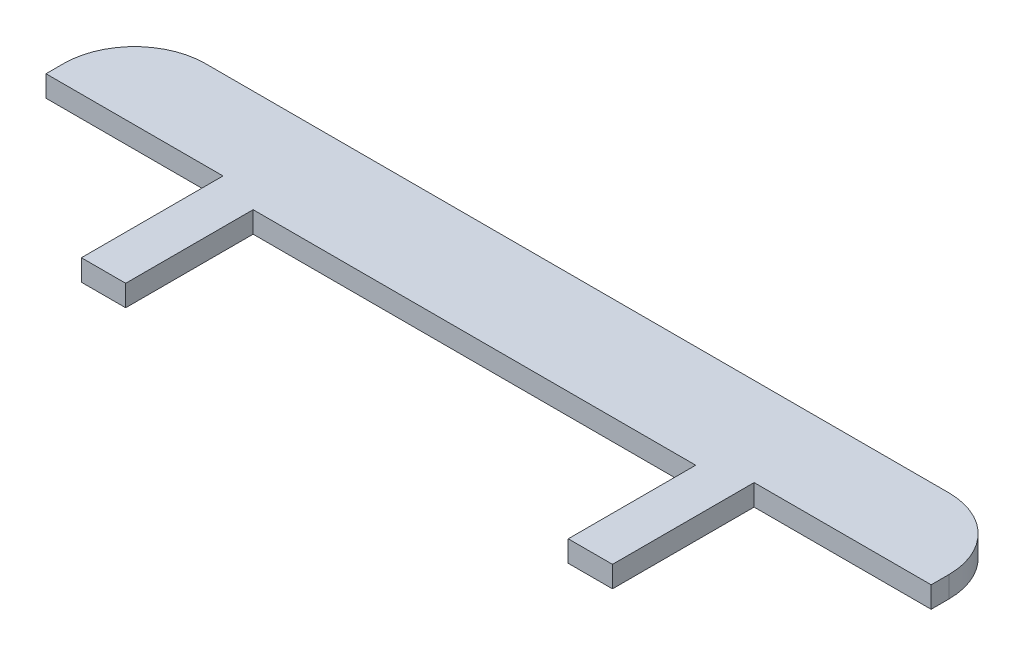
ISO-10303-21;
HEADER;
FILE_DESCRIPTION(('STEP AP214'),'2;1');
FILE_NAME('part.step','',(''),(''),'','','');
FILE_SCHEMA(('AUTOMOTIVE_DESIGN { 1 0 10303 214 1 1 1 1 }'));
ENDSEC;
DATA;
#1=APPLICATION_CONTEXT('core data for automotive mechanical design processes');
#2=APPLICATION_PROTOCOL_DEFINITION('international standard','automotive_design',2000,#1);
#3=PRODUCT_CONTEXT('',#1,'mechanical');
#4=PRODUCT('Part','Part','',(#3));
#5=PRODUCT_RELATED_PRODUCT_CATEGORY('part','',(#4));
#6=PRODUCT_DEFINITION_FORMATION('','',#4);
#7=PRODUCT_DEFINITION_CONTEXT('part definition',#1,'design');
#8=PRODUCT_DEFINITION('design','',#6,#7);
#9=PRODUCT_DEFINITION_SHAPE('','',#8);
#10=(LENGTH_UNIT() NAMED_UNIT(*) SI_UNIT(.MILLI.,.METRE.));
#11=(NAMED_UNIT(*) PLANE_ANGLE_UNIT() SI_UNIT($,.RADIAN.));
#12=(NAMED_UNIT(*) SI_UNIT($,.STERADIAN.) SOLID_ANGLE_UNIT());
#13=UNCERTAINTY_MEASURE_WITH_UNIT(LENGTH_MEASURE(1.E-05),#10,'distance_accuracy_value','');
#14=(GEOMETRIC_REPRESENTATION_CONTEXT(3) GLOBAL_UNCERTAINTY_ASSIGNED_CONTEXT((#13)) GLOBAL_UNIT_ASSIGNED_CONTEXT((#10,
#11,#12)) REPRESENTATION_CONTEXT('',''));
#15=CARTESIAN_POINT('',(0.,0.,0.));
#16=DIRECTION('',(0.,0.,1.));
#17=DIRECTION('',(1.,0.,0.));
#18=AXIS2_PLACEMENT_3D('',#15,#16,#17);
#19=CARTESIAN_POINT('',(-31.75,1.524,0.));
#20=DIRECTION('',(1.,0.,0.));
#21=DIRECTION('',(0.,0.,-1.));
#22=AXIS2_PLACEMENT_3D('',#19,#20,#21);
#23=PLANE('',#22);
#24=DIRECTION('',(0.,0.,1.));
#25=VECTOR('',#24,1.);
#26=CARTESIAN_POINT('',(-31.75,1.524,0.));
#27=LINE('',#26,#25);
#28=CARTESIAN_POINT('',(-31.75,1.524,-1.27));
#29=VERTEX_POINT('',#28);
#30=CARTESIAN_POINT('',(-31.75,1.524,0.));
#31=VERTEX_POINT('',#30);
#32=EDGE_CURVE('E143',#29,#31,#27,.T.);
#33=ORIENTED_EDGE('',*,*,#32,.F.);
#34=DIRECTION('',(0.,-1.,0.));
#35=VECTOR('',#34,1.);
#36=CARTESIAN_POINT('',(-31.75,1.524,-1.27));
#37=LINE('',#36,#35);
#38=CARTESIAN_POINT('',(-31.75,0.,-1.27));
#39=VERTEX_POINT('',#38);
#40=EDGE_CURVE('E11',#29,#39,#37,.T.);
#41=ORIENTED_EDGE('',*,*,#40,.T.);
#42=DIRECTION('',(0.,0.,1.));
#43=VECTOR('',#42,1.);
#44=CARTESIAN_POINT('',(-31.75,0.,0.));
#45=LINE('',#44,#43);
#46=CARTESIAN_POINT('',(-31.75,0.,0.));
#47=VERTEX_POINT('',#46);
#48=EDGE_CURVE('E165',#39,#47,#45,.T.);
#49=ORIENTED_EDGE('',*,*,#48,.T.);
#50=DIRECTION('',(0.,-1.,0.));
#51=VECTOR('',#50,1.);
#52=CARTESIAN_POINT('',(-31.75,1.524,0.));
#53=LINE('',#52,#51);
#54=EDGE_CURVE('E157',#31,#47,#53,.T.);
#55=ORIENTED_EDGE('',*,*,#54,.F.);
#56=EDGE_LOOP('',(#33,#41,#49,#55));
#57=FACE_BOUND('',#56,.T.);
#58=ADVANCED_FACE('F41',(#57),#23,.F.);
#59=CARTESIAN_POINT('',(-31.75,1.524,0.));
#60=DIRECTION('',(0.,0.,-1.));
#61=DIRECTION('',(-1.,0.,0.));
#62=AXIS2_PLACEMENT_3D('',#59,#60,#61);
#63=PLANE('',#62);
#64=DIRECTION('',(1.,0.,0.));
#65=VECTOR('',#64,1.);
#66=CARTESIAN_POINT('',(-31.75,0.,0.));
#67=LINE('',#66,#65);
#68=CARTESIAN_POINT('',(-19.05,0.,0.));
#69=VERTEX_POINT('',#68);
#70=EDGE_CURVE('E271',#47,#69,#67,.T.);
#71=ORIENTED_EDGE('',*,*,#70,.T.);
#72=DIRECTION('',(0.,-1.,0.));
#73=VECTOR('',#72,1.);
#74=CARTESIAN_POINT('',(-19.05,1.524,0.));
#75=LINE('',#74,#73);
#76=CARTESIAN_POINT('',(-19.05,1.524,0.));
#77=VERTEX_POINT('',#76);
#78=EDGE_CURVE('E159',#77,#69,#75,.T.);
#79=ORIENTED_EDGE('',*,*,#78,.F.);
#80=DIRECTION('',(1.,0.,0.));
#81=VECTOR('',#80,1.);
#82=CARTESIAN_POINT('',(-31.75,1.524,0.));
#83=LINE('',#82,#81);
#84=EDGE_CURVE('E146',#31,#77,#83,.T.);
#85=ORIENTED_EDGE('',*,*,#84,.F.);
#86=ORIENTED_EDGE('',*,*,#54,.T.);
#87=EDGE_LOOP('',(#71,#79,#85,#86));
#88=FACE_BOUND('',#87,.T.);
#89=ADVANCED_FACE('F156',(#88),#63,.F.);
#90=CARTESIAN_POINT('',(-19.05,1.524,0.));
#91=DIRECTION('',(1.,0.,0.));
#92=DIRECTION('',(0.,0.,-1.));
#93=AXIS2_PLACEMENT_3D('',#90,#91,#92);
#94=PLANE('',#93);
#95=DIRECTION('',(0.,0.,1.));
#96=VECTOR('',#95,1.);
#97=CARTESIAN_POINT('',(-19.05,0.,0.));
#98=LINE('',#97,#96);
#99=CARTESIAN_POINT('',(-19.05,0.,10.16));
#100=VERTEX_POINT('',#99);
#101=EDGE_CURVE('E262',#69,#100,#98,.T.);
#102=ORIENTED_EDGE('',*,*,#101,.T.);
#103=DIRECTION('',(0.,-1.,0.));
#104=VECTOR('',#103,1.);
#105=CARTESIAN_POINT('',(-19.05,1.524,10.16));
#106=LINE('',#105,#104);
#107=CARTESIAN_POINT('',(-19.05,1.524,10.16));
#108=VERTEX_POINT('',#107);
#109=EDGE_CURVE('E174',#108,#100,#106,.T.);
#110=ORIENTED_EDGE('',*,*,#109,.F.);
#111=DIRECTION('',(0.,0.,1.));
#112=VECTOR('',#111,1.);
#113=CARTESIAN_POINT('',(-19.05,1.524,0.));
#114=LINE('',#113,#112);
#115=EDGE_CURVE('E162',#77,#108,#114,.T.);
#116=ORIENTED_EDGE('',*,*,#115,.F.);
#117=ORIENTED_EDGE('',*,*,#78,.T.);
#118=EDGE_LOOP('',(#102,#110,#116,#117));
#119=FACE_BOUND('',#118,.T.);
#120=ADVANCED_FACE('F306',(#119),#94,.F.);
#121=CARTESIAN_POINT('',(-19.05,1.524,10.16));
#122=DIRECTION('',(0.,0.,-1.));
#123=DIRECTION('',(-1.,0.,0.));
#124=AXIS2_PLACEMENT_3D('',#121,#122,#123);
#125=PLANE('',#124);
#126=DIRECTION('',(1.,0.,0.));
#127=VECTOR('',#126,1.);
#128=CARTESIAN_POINT('',(-19.05,0.,10.16));
#129=LINE('',#128,#127);
#130=CARTESIAN_POINT('',(-15.875,0.,10.16));
#131=VERTEX_POINT('',#130);
#132=EDGE_CURVE('E257',#100,#131,#129,.T.);
#133=ORIENTED_EDGE('',*,*,#132,.T.);
#134=DIRECTION('',(0.,-1.,0.));
#135=VECTOR('',#134,1.);
#136=CARTESIAN_POINT('',(-15.875,1.524,10.16));
#137=LINE('',#136,#135);
#138=CARTESIAN_POINT('',(-15.875,1.524,10.16));
#139=VERTEX_POINT('',#138);
#140=EDGE_CURVE('E246',#139,#131,#137,.T.);
#141=ORIENTED_EDGE('',*,*,#140,.F.);
#142=DIRECTION('',(1.,0.,0.));
#143=VECTOR('',#142,1.);
#144=CARTESIAN_POINT('',(-19.05,1.524,10.16));
#145=LINE('',#144,#143);
#146=EDGE_CURVE('E258',#108,#139,#145,.T.);
#147=ORIENTED_EDGE('',*,*,#146,.F.);
#148=ORIENTED_EDGE('',*,*,#109,.T.);
#149=EDGE_LOOP('',(#133,#141,#147,#148));
#150=FACE_BOUND('',#149,.T.);
#151=ADVANCED_FACE('F255',(#150),#125,.F.);
#152=CARTESIAN_POINT('',(-15.875,1.524,10.16));
#153=DIRECTION('',(-1.,0.,0.));
#154=DIRECTION('',(0.,0.,1.));
#155=AXIS2_PLACEMENT_3D('',#152,#153,#154);
#156=PLANE('',#155);
#157=DIRECTION('',(0.,0.,-1.));
#158=VECTOR('',#157,1.);
#159=CARTESIAN_POINT('',(-15.875,0.,10.16));
#160=LINE('',#159,#158);
#161=CARTESIAN_POINT('',(-15.875,0.,1.016));
#162=VERTEX_POINT('',#161);
#163=EDGE_CURVE('E264',#131,#162,#160,.T.);
#164=ORIENTED_EDGE('',*,*,#163,.T.);
#165=DIRECTION('',(0.,-1.,0.));
#166=VECTOR('',#165,1.);
#167=CARTESIAN_POINT('',(-15.875,1.524,1.016));
#168=LINE('',#167,#166);
#169=CARTESIAN_POINT('',(-15.875,1.524,1.016));
#170=VERTEX_POINT('',#169);
#171=EDGE_CURVE('E242',#170,#162,#168,.T.);
#172=ORIENTED_EDGE('',*,*,#171,.F.);
#173=DIRECTION('',(0.,0.,-1.));
#174=VECTOR('',#173,1.);
#175=CARTESIAN_POINT('',(-15.875,1.524,10.16));
#176=LINE('',#175,#174);
#177=EDGE_CURVE('E310',#139,#170,#176,.T.);
#178=ORIENTED_EDGE('',*,*,#177,.F.);
#179=ORIENTED_EDGE('',*,*,#140,.T.);
#180=EDGE_LOOP('',(#164,#172,#178,#179));
#181=FACE_BOUND('',#180,.T.);
#182=ADVANCED_FACE('F336',(#181),#156,.F.);
#183=CARTESIAN_POINT('',(-15.875,1.524,1.016));
#184=DIRECTION('',(0.,0.,-1.));
#185=DIRECTION('',(-1.,0.,0.));
#186=AXIS2_PLACEMENT_3D('',#183,#184,#185);
#187=PLANE('',#186);
#188=DIRECTION('',(1.,0.,0.));
#189=VECTOR('',#188,1.);
#190=CARTESIAN_POINT('',(-15.875,0.,1.016));
#191=LINE('',#190,#189);
#192=CARTESIAN_POINT('',(15.875,0.,1.016));
#193=VERTEX_POINT('',#192);
#194=EDGE_CURVE('E269',#162,#193,#191,.T.);
#195=ORIENTED_EDGE('',*,*,#194,.T.);
#196=DIRECTION('',(0.,-1.,0.));
#197=VECTOR('',#196,1.);
#198=CARTESIAN_POINT('',(15.875,1.524,1.016));
#199=LINE('',#198,#197);
#200=CARTESIAN_POINT('',(15.875,1.524,1.016));
#201=VERTEX_POINT('',#200);
#202=EDGE_CURVE('E238',#201,#193,#199,.T.);
#203=ORIENTED_EDGE('',*,*,#202,.F.);
#204=DIRECTION('',(1.,0.,0.));
#205=VECTOR('',#204,1.);
#206=CARTESIAN_POINT('',(-15.875,1.524,1.016));
#207=LINE('',#206,#205);
#208=EDGE_CURVE('E315',#170,#201,#207,.T.);
#209=ORIENTED_EDGE('',*,*,#208,.F.);
#210=ORIENTED_EDGE('',*,*,#171,.T.);
#211=EDGE_LOOP('',(#195,#203,#209,#210));
#212=FACE_BOUND('',#211,.T.);
#213=ADVANCED_FACE('F332',(#212),#187,.F.);
#214=CARTESIAN_POINT('',(15.875,1.524,10.16));
#215=DIRECTION('',(1.,0.,0.));
#216=DIRECTION('',(0.,0.,-1.));
#217=AXIS2_PLACEMENT_3D('',#214,#215,#216);
#218=PLANE('',#217);
#219=DIRECTION('',(0.,0.,1.));
#220=VECTOR('',#219,1.);
#221=CARTESIAN_POINT('',(15.875,0.,10.16));
#222=LINE('',#221,#220);
#223=CARTESIAN_POINT('',(15.875,0.,10.16));
#224=VERTEX_POINT('',#223);
#225=EDGE_CURVE('E277',#193,#224,#222,.T.);
#226=ORIENTED_EDGE('',*,*,#225,.T.);
#227=DIRECTION('',(0.,-1.,0.));
#228=VECTOR('',#227,1.);
#229=CARTESIAN_POINT('',(15.875,1.524,10.16));
#230=LINE('',#229,#228);
#231=CARTESIAN_POINT('',(15.875,1.524,10.16));
#232=VERTEX_POINT('',#231);
#233=EDGE_CURVE('E234',#232,#224,#230,.T.);
#234=ORIENTED_EDGE('',*,*,#233,.F.);
#235=DIRECTION('',(0.,0.,1.));
#236=VECTOR('',#235,1.);
#237=CARTESIAN_POINT('',(15.875,1.524,10.16));
#238=LINE('',#237,#236);
#239=EDGE_CURVE('E318',#201,#232,#238,.T.);
#240=ORIENTED_EDGE('',*,*,#239,.F.);
#241=ORIENTED_EDGE('',*,*,#202,.T.);
#242=EDGE_LOOP('',(#226,#234,#240,#241));
#243=FACE_BOUND('',#242,.T.);
#244=ADVANCED_FACE('F328',(#243),#218,.F.);
#245=CARTESIAN_POINT('',(15.875,1.524,10.16));
#246=DIRECTION('',(0.,0.,-1.));
#247=DIRECTION('',(-1.,0.,0.));
#248=AXIS2_PLACEMENT_3D('',#245,#246,#247);
#249=PLANE('',#248);
#250=DIRECTION('',(1.,0.,0.));
#251=VECTOR('',#250,1.);
#252=CARTESIAN_POINT('',(15.875,0.,10.16));
#253=LINE('',#252,#251);
#254=CARTESIAN_POINT('',(19.05,0.,10.16));
#255=VERTEX_POINT('',#254);
#256=EDGE_CURVE('E280',#224,#255,#253,.T.);
#257=ORIENTED_EDGE('',*,*,#256,.T.);
#258=DIRECTION('',(0.,-1.,0.));
#259=VECTOR('',#258,1.);
#260=CARTESIAN_POINT('',(19.05,1.524,10.16));
#261=LINE('',#260,#259);
#262=CARTESIAN_POINT('',(19.05,1.524,10.16));
#263=VERTEX_POINT('',#262);
#264=EDGE_CURVE('E230',#263,#255,#261,.T.);
#265=ORIENTED_EDGE('',*,*,#264,.F.);
#266=DIRECTION('',(1.,0.,0.));
#267=VECTOR('',#266,1.);
#268=CARTESIAN_POINT('',(15.875,1.524,10.16));
#269=LINE('',#268,#267);
#270=EDGE_CURVE('E300',#232,#263,#269,.T.);
#271=ORIENTED_EDGE('',*,*,#270,.F.);
#272=ORIENTED_EDGE('',*,*,#233,.T.);
#273=EDGE_LOOP('',(#257,#265,#271,#272));
#274=FACE_BOUND('',#273,.T.);
#275=ADVANCED_FACE('F325',(#274),#249,.F.);
#276=CARTESIAN_POINT('',(19.05,1.524,0.));
#277=DIRECTION('',(-1.,0.,0.));
#278=DIRECTION('',(0.,0.,1.));
#279=AXIS2_PLACEMENT_3D('',#276,#277,#278);
#280=PLANE('',#279);
#281=DIRECTION('',(0.,0.,-1.));
#282=VECTOR('',#281,1.);
#283=CARTESIAN_POINT('',(19.05,0.,0.));
#284=LINE('',#283,#282);
#285=CARTESIAN_POINT('',(19.05,0.,0.));
#286=VERTEX_POINT('',#285);
#287=EDGE_CURVE('E220',#255,#286,#284,.T.);
#288=ORIENTED_EDGE('',*,*,#287,.T.);
#289=DIRECTION('',(0.,-1.,0.));
#290=VECTOR('',#289,1.);
#291=CARTESIAN_POINT('',(19.05,1.524,0.));
#292=LINE('',#291,#290);
#293=CARTESIAN_POINT('',(19.05,1.524,0.));
#294=VERTEX_POINT('',#293);
#295=EDGE_CURVE('E226',#294,#286,#292,.T.);
#296=ORIENTED_EDGE('',*,*,#295,.F.);
#297=DIRECTION('',(0.,0.,-1.));
#298=VECTOR('',#297,1.);
#299=CARTESIAN_POINT('',(19.05,1.524,0.));
#300=LINE('',#299,#298);
#301=EDGE_CURVE('E295',#263,#294,#300,.T.);
#302=ORIENTED_EDGE('',*,*,#301,.F.);
#303=ORIENTED_EDGE('',*,*,#264,.T.);
#304=EDGE_LOOP('',(#288,#296,#302,#303));
#305=FACE_BOUND('',#304,.T.);
#306=ADVANCED_FACE('F286',(#305),#280,.F.);
#307=CARTESIAN_POINT('',(19.05,1.524,0.));
#308=DIRECTION('',(0.,0.,-1.));
#309=DIRECTION('',(-1.,0.,0.));
#310=AXIS2_PLACEMENT_3D('',#307,#308,#309);
#311=PLANE('',#310);
#312=DIRECTION('',(1.,0.,0.));
#313=VECTOR('',#312,1.);
#314=CARTESIAN_POINT('',(19.05,0.,0.));
#315=LINE('',#314,#313);
#316=CARTESIAN_POINT('',(31.75,0.,0.));
#317=VERTEX_POINT('',#316);
#318=EDGE_CURVE('E215',#286,#317,#315,.T.);
#319=ORIENTED_EDGE('',*,*,#318,.T.);
#320=DIRECTION('',(0.,-1.,0.));
#321=VECTOR('',#320,1.);
#322=CARTESIAN_POINT('',(31.75,1.524,0.));
#323=LINE('',#322,#321);
#324=CARTESIAN_POINT('',(31.75,1.524,0.));
#325=VERTEX_POINT('',#324);
#326=EDGE_CURVE('E203',#325,#317,#323,.T.);
#327=ORIENTED_EDGE('',*,*,#326,.F.);
#328=DIRECTION('',(1.,0.,0.));
#329=VECTOR('',#328,1.);
#330=CARTESIAN_POINT('',(19.05,1.524,0.));
#331=LINE('',#330,#329);
#332=EDGE_CURVE('E293',#294,#325,#331,.T.);
#333=ORIENTED_EDGE('',*,*,#332,.F.);
#334=ORIENTED_EDGE('',*,*,#295,.T.);
#335=EDGE_LOOP('',(#319,#327,#333,#334));
#336=FACE_BOUND('',#335,.T.);
#337=ADVANCED_FACE('F292',(#336),#311,.F.);
#338=CARTESIAN_POINT('',(31.75,1.524,0.));
#339=DIRECTION('',(-1.,0.,0.));
#340=DIRECTION('',(0.,0.,1.));
#341=AXIS2_PLACEMENT_3D('',#338,#339,#340);
#342=PLANE('',#341);
#343=DIRECTION('',(0.,0.,-1.));
#344=VECTOR('',#343,1.);
#345=CARTESIAN_POINT('',(31.75,0.,0.));
#346=LINE('',#345,#344);
#347=CARTESIAN_POINT('',(31.75,0.,-1.27));
#348=VERTEX_POINT('',#347);
#349=EDGE_CURVE('E210',#317,#348,#346,.T.);
#350=ORIENTED_EDGE('',*,*,#349,.T.);
#351=DIRECTION('',(0.,-1.,0.));
#352=VECTOR('',#351,1.);
#353=CARTESIAN_POINT('',(31.75,1.524,-1.27));
#354=LINE('',#353,#352);
#355=CARTESIAN_POINT('',(31.75,1.524,-1.27));
#356=VERTEX_POINT('',#355);
#357=EDGE_CURVE('E65',#348,#356,#354,.F.);
#358=ORIENTED_EDGE('',*,*,#357,.T.);
#359=DIRECTION('',(0.,0.,-1.));
#360=VECTOR('',#359,1.);
#361=CARTESIAN_POINT('',(31.75,1.524,0.));
#362=LINE('',#361,#360);
#363=EDGE_CURVE('E194',#325,#356,#362,.T.);
#364=ORIENTED_EDGE('',*,*,#363,.F.);
#365=ORIENTED_EDGE('',*,*,#326,.T.);
#366=EDGE_LOOP('',(#350,#358,#364,#365));
#367=FACE_BOUND('',#366,.T.);
#368=ADVANCED_FACE('F212',(#367),#342,.F.);
#369=CARTESIAN_POINT('',(-31.75,1.524,-6.35));
#370=DIRECTION('',(0.,0.,1.));
#371=DIRECTION('',(1.,0.,0.));
#372=AXIS2_PLACEMENT_3D('',#369,#370,#371);
#373=PLANE('',#372);
#374=DIRECTION('',(-1.,0.,0.));
#375=VECTOR('',#374,1.);
#376=CARTESIAN_POINT('',(-31.75,1.524,-6.35));
#377=LINE('',#376,#375);
#378=CARTESIAN_POINT('',(26.67,1.524,-6.35));
#379=VERTEX_POINT('',#378);
#380=CARTESIAN_POINT('',(-26.67,1.524,-6.35));
#381=VERTEX_POINT('',#380);
#382=EDGE_CURVE('E193',#379,#381,#377,.T.);
#383=ORIENTED_EDGE('',*,*,#382,.F.);
#384=DIRECTION('',(0.,-1.,0.));
#385=VECTOR('',#384,1.);
#386=CARTESIAN_POINT('',(26.67,1.524,-6.35));
#387=LINE('',#386,#385);
#388=CARTESIAN_POINT('',(26.67,0.,-6.35));
#389=VERTEX_POINT('',#388);
#390=EDGE_CURVE('E172',#379,#389,#387,.T.);
#391=ORIENTED_EDGE('',*,*,#390,.T.);
#392=DIRECTION('',(-1.,0.,0.));
#393=VECTOR('',#392,1.);
#394=CARTESIAN_POINT('',(-31.75,0.,-6.35));
#395=LINE('',#394,#393);
#396=CARTESIAN_POINT('',(-26.67,0.,-6.35));
#397=VERTEX_POINT('',#396);
#398=EDGE_CURVE('E152',#389,#397,#395,.T.);
#399=ORIENTED_EDGE('',*,*,#398,.T.);
#400=DIRECTION('',(0.,-1.,0.));
#401=VECTOR('',#400,1.);
#402=CARTESIAN_POINT('',(-26.67,1.524,-6.35));
#403=LINE('',#402,#401);
#404=EDGE_CURVE('E168',#397,#381,#403,.F.);
#405=ORIENTED_EDGE('',*,*,#404,.T.);
#406=EDGE_LOOP('',(#383,#391,#399,#405));
#407=FACE_BOUND('',#406,.T.);
#408=ADVANCED_FACE('F198',(#407),#373,.F.);
#409=CARTESIAN_POINT('',(0.,1.524,0.));
#410=DIRECTION('',(0.,-1.,0.));
#411=DIRECTION('',(0.,0.,-1.));
#412=AXIS2_PLACEMENT_3D('',#409,#410,#411);
#413=PLANE('',#412);
#414=ORIENTED_EDGE('',*,*,#363,.T.);
#415=CARTESIAN_POINT('',(26.67,1.524,-1.27));
#416=DIRECTION('',(0.,-1.,0.));
#417=DIRECTION('',(0.,0.,-1.));
#418=AXIS2_PLACEMENT_3D('',#415,#416,#417);
#419=CIRCLE('',#418,5.08);
#420=EDGE_CURVE('E50',#356,#379,#419,.F.);
#421=ORIENTED_EDGE('',*,*,#420,.T.);
#422=ORIENTED_EDGE('',*,*,#382,.T.);
#423=CARTESIAN_POINT('',(-26.67,1.524,-1.27));
#424=DIRECTION('',(0.,-1.,0.));
#425=DIRECTION('',(0.,0.,-1.));
#426=AXIS2_PLACEMENT_3D('',#423,#424,#425);
#427=CIRCLE('',#426,5.08);
#428=EDGE_CURVE('E57',#381,#29,#427,.F.);
#429=ORIENTED_EDGE('',*,*,#428,.T.);
#430=ORIENTED_EDGE('',*,*,#32,.T.);
#431=ORIENTED_EDGE('',*,*,#84,.T.);
#432=ORIENTED_EDGE('',*,*,#115,.T.);
#433=ORIENTED_EDGE('',*,*,#146,.T.);
#434=ORIENTED_EDGE('',*,*,#177,.T.);
#435=ORIENTED_EDGE('',*,*,#208,.T.);
#436=ORIENTED_EDGE('',*,*,#239,.T.);
#437=ORIENTED_EDGE('',*,*,#270,.T.);
#438=ORIENTED_EDGE('',*,*,#301,.T.);
#439=ORIENTED_EDGE('',*,*,#332,.T.);
#440=EDGE_LOOP('',(#414,#421,#422,#429,#430,#431,#432,#433,#434,#435,#436,#437,#438,#439));
#441=FACE_BOUND('',#440,.T.);
#442=ADVANCED_FACE('F145',(#441),#413,.F.);
#443=CARTESIAN_POINT('',(0.,0.,0.));
#444=DIRECTION('',(0.,-1.,0.));
#445=DIRECTION('',(0.,0.,-1.));
#446=AXIS2_PLACEMENT_3D('',#443,#444,#445);
#447=PLANE('',#446);
#448=ORIENTED_EDGE('',*,*,#398,.F.);
#449=CARTESIAN_POINT('',(26.67,0.,-1.27));
#450=DIRECTION('',(0.,-1.,0.));
#451=DIRECTION('',(0.,0.,-1.));
#452=AXIS2_PLACEMENT_3D('',#449,#450,#451);
#453=CIRCLE('',#452,5.08);
#454=EDGE_CURVE('E184',#389,#348,#453,.T.);
#455=ORIENTED_EDGE('',*,*,#454,.T.);
#456=ORIENTED_EDGE('',*,*,#349,.F.);
#457=ORIENTED_EDGE('',*,*,#318,.F.);
#458=ORIENTED_EDGE('',*,*,#287,.F.);
#459=ORIENTED_EDGE('',*,*,#256,.F.);
#460=ORIENTED_EDGE('',*,*,#225,.F.);
#461=ORIENTED_EDGE('',*,*,#194,.F.);
#462=ORIENTED_EDGE('',*,*,#163,.F.);
#463=ORIENTED_EDGE('',*,*,#132,.F.);
#464=ORIENTED_EDGE('',*,*,#101,.F.);
#465=ORIENTED_EDGE('',*,*,#70,.F.);
#466=ORIENTED_EDGE('',*,*,#48,.F.);
#467=CARTESIAN_POINT('',(-26.67,0.,-1.27));
#468=DIRECTION('',(0.,-1.,0.));
#469=DIRECTION('',(0.,0.,-1.));
#470=AXIS2_PLACEMENT_3D('',#467,#468,#469);
#471=CIRCLE('',#470,5.08);
#472=EDGE_CURVE('E181',#39,#397,#471,.T.);
#473=ORIENTED_EDGE('',*,*,#472,.T.);
#474=EDGE_LOOP('',(#448,#455,#456,#457,#458,#459,#460,#461,#462,#463,#464,#465,#466,#473));
#475=FACE_BOUND('',#474,.T.);
#476=ADVANCED_FACE('F208',(#475),#447,.T.);
#477=CARTESIAN_POINT('',(26.67,1.524,-1.27));
#478=DIRECTION('',(0.,-1.,0.));
#479=DIRECTION('',(0.,0.,-1.));
#480=AXIS2_PLACEMENT_3D('',#477,#478,#479);
#481=CYLINDRICAL_SURFACE('',#480,5.08);
#482=ORIENTED_EDGE('',*,*,#420,.F.);
#483=ORIENTED_EDGE('',*,*,#357,.F.);
#484=ORIENTED_EDGE('',*,*,#454,.F.);
#485=ORIENTED_EDGE('',*,*,#390,.F.);
#486=EDGE_LOOP('',(#482,#483,#484,#485));
#487=FACE_BOUND('',#486,.T.);
#488=ADVANCED_FACE('F205',(#487),#481,.T.);
#489=CARTESIAN_POINT('',(-26.67,1.524,-1.27));
#490=DIRECTION('',(0.,-1.,0.));
#491=DIRECTION('',(0.,0.,-1.));
#492=AXIS2_PLACEMENT_3D('',#489,#490,#491);
#493=CYLINDRICAL_SURFACE('',#492,5.08);
#494=ORIENTED_EDGE('',*,*,#428,.F.);
#495=ORIENTED_EDGE('',*,*,#404,.F.);
#496=ORIENTED_EDGE('',*,*,#472,.F.);
#497=ORIENTED_EDGE('',*,*,#40,.F.);
#498=EDGE_LOOP('',(#494,#495,#496,#497));
#499=FACE_BOUND('',#498,.T.);
#500=ADVANCED_FACE('F43',(#499),#493,.T.);
#501=CLOSED_SHELL('',(#58,#89,#120,#151,#182,#213,#244,#275,#306,#337,#368,#408,#442,#476,#488,#500));
#502=MANIFOLD_SOLID_BREP('B2',#501);
#503=ADVANCED_BREP_SHAPE_REPRESENTATION('',(#18,#502),#14);
#504=SHAPE_DEFINITION_REPRESENTATION(#9,#503);
ENDSEC;
END-ISO-10303-21;
